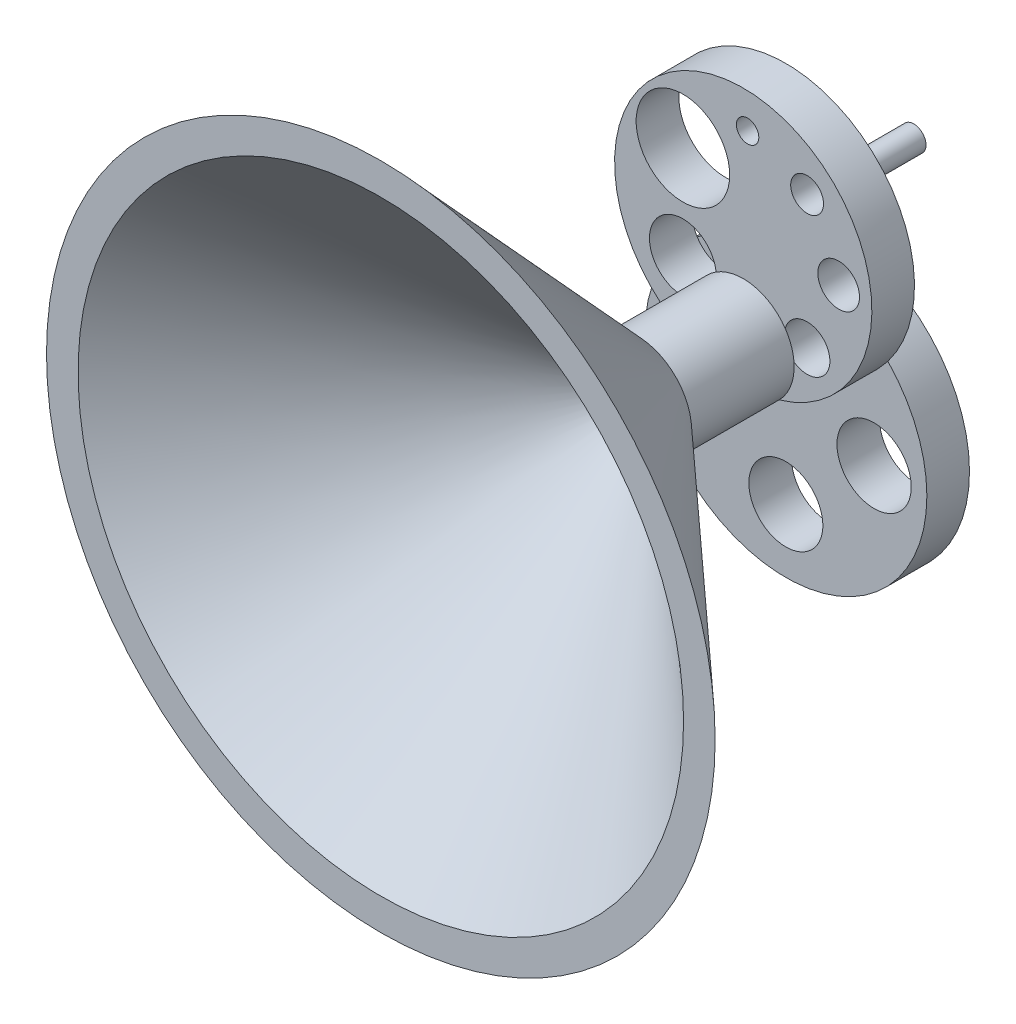
ISO-10303-21;
HEADER;
FILE_DESCRIPTION(('STEP AP214'),'2;1');
FILE_NAME('part.step','',(''),(''),'','','');
FILE_SCHEMA(('AUTOMOTIVE_DESIGN { 1 0 10303 214 1 1 1 1 }'));
ENDSEC;
DATA;
#1=APPLICATION_CONTEXT('core data for automotive mechanical design processes');
#2=APPLICATION_PROTOCOL_DEFINITION('international standard','automotive_design',2000,#1);
#3=PRODUCT_CONTEXT('',#1,'mechanical');
#4=PRODUCT('Part','Part','',(#3));
#5=PRODUCT_RELATED_PRODUCT_CATEGORY('part','',(#4));
#6=PRODUCT_DEFINITION_FORMATION('','',#4);
#7=PRODUCT_DEFINITION_CONTEXT('part definition',#1,'design');
#8=PRODUCT_DEFINITION('design','',#6,#7);
#9=PRODUCT_DEFINITION_SHAPE('','',#8);
#10=(LENGTH_UNIT() NAMED_UNIT(*) SI_UNIT(.MILLI.,.METRE.));
#11=(NAMED_UNIT(*) PLANE_ANGLE_UNIT() SI_UNIT($,.RADIAN.));
#12=(NAMED_UNIT(*) SI_UNIT($,.STERADIAN.) SOLID_ANGLE_UNIT());
#13=UNCERTAINTY_MEASURE_WITH_UNIT(LENGTH_MEASURE(1.E-05),#10,'distance_accuracy_value','');
#14=(GEOMETRIC_REPRESENTATION_CONTEXT(3) GLOBAL_UNCERTAINTY_ASSIGNED_CONTEXT((#13)) GLOBAL_UNIT_ASSIGNED_CONTEXT((#10,
#11,#12)) REPRESENTATION_CONTEXT('',''));
#15=CARTESIAN_POINT('',(0.,0.,0.));
#16=DIRECTION('',(0.,0.,1.));
#17=DIRECTION('',(1.,0.,0.));
#18=AXIS2_PLACEMENT_3D('',#15,#16,#17);
#19=CARTESIAN_POINT('',(0.,0.,0.));
#20=DIRECTION('',(0.,0.,1.));
#21=DIRECTION('',(1.,0.,0.));
#22=AXIS2_PLACEMENT_3D('',#19,#20,#21);
#23=PLANE('',#22);
#24=CARTESIAN_POINT('',(0.,-40.9991247059426,0.));
#25=DIRECTION('',(0.,0.,1.));
#26=DIRECTION('',(1.,0.,0.));
#27=AXIS2_PLACEMENT_3D('',#24,#25,#26);
#28=CIRCLE('',#27,12.5359342490684);
#29=CARTESIAN_POINT('',(12.5359342490684,-40.9991247059426,0.));
#30=VERTEX_POINT('',#29);
#31=EDGE_CURVE('E201',#30,#30,#28,.T.);
#32=ORIENTED_EDGE('',*,*,#31,.T.);
#33=EDGE_LOOP('',(#32));
#34=FACE_BOUND('',#33,.T.);
#35=CARTESIAN_POINT('',(-28.2941248850961,-22.6344067342699,0.));
#36=DIRECTION('',(0.,0.,1.));
#37=DIRECTION('',(1.,0.,0.));
#38=AXIS2_PLACEMENT_3D('',#35,#36,#37);
#39=CIRCLE('',#38,15.6917448653745);
#40=CARTESIAN_POINT('',(-18.0456026648547,-34.5171105183935,0.));
#41=VERTEX_POINT('',#40);
#42=CARTESIAN_POINT('',(-13.268101982062,-27.1565182584921,0.));
#43=VERTEX_POINT('',#42);
#44=EDGE_CURVE('E105',#41,#43,#39,.T.);
#45=ORIENTED_EDGE('',*,*,#44,.T.);
#46=CARTESIAN_POINT('',(0.,-40.9991247059426,0.));
#47=DIRECTION('',(0.,0.,-1.));
#48=DIRECTION('',(-1.,0.,0.));
#49=AXIS2_PLACEMENT_3D('',#46,#47,#48);
#50=CIRCLE('',#49,19.1744695745514);
#51=EDGE_CURVE('E117',#43,#41,#50,.T.);
#52=ORIENTED_EDGE('',*,*,#51,.T.);
#53=EDGE_LOOP('',(#45,#52));
#54=FACE_BOUND('',#53,.T.);
#55=ADVANCED_FACE('F41',(#34,#54),#23,.F.);
#56=CARTESIAN_POINT('',(0.,0.,20.));
#57=DIRECTION('',(0.,0.,1.));
#58=DIRECTION('',(1.,0.,0.));
#59=AXIS2_PLACEMENT_3D('',#56,#57,#58);
#60=PLANE('',#59);
#61=CARTESIAN_POINT('',(0.,-40.9991247059426,20.));
#62=DIRECTION('',(0.,0.,1.));
#63=DIRECTION('',(1.,0.,0.));
#64=AXIS2_PLACEMENT_3D('',#61,#62,#63);
#65=CIRCLE('',#64,12.5359342490684);
#66=CARTESIAN_POINT('',(12.5359342490684,-40.9991247059426,20.));
#67=VERTEX_POINT('',#66);
#68=EDGE_CURVE('E206',#67,#67,#65,.T.);
#69=ORIENTED_EDGE('',*,*,#68,.F.);
#70=EDGE_LOOP('',(#69));
#71=FACE_BOUND('',#70,.T.);
#72=CARTESIAN_POINT('',(-28.2941248850961,-22.6344067342699,20.));
#73=DIRECTION('',(0.,0.,1.));
#74=DIRECTION('',(1.,0.,0.));
#75=AXIS2_PLACEMENT_3D('',#72,#73,#74);
#76=CIRCLE('',#75,15.6917448653745);
#77=CARTESIAN_POINT('',(-16.6565006443831,-33.1604011743205,20.));
#78=VERTEX_POINT('',#77);
#79=CARTESIAN_POINT('',(-13.9416404614238,-28.9776746450751,20.));
#80=VERTEX_POINT('',#79);
#81=EDGE_CURVE('E283',#78,#80,#76,.T.);
#82=ORIENTED_EDGE('',*,*,#81,.F.);
#83=CARTESIAN_POINT('',(0.,-40.9991247059426,20.));
#84=DIRECTION('',(0.,0.,1.));
#85=DIRECTION('',(1.,0.,0.));
#86=AXIS2_PLACEMENT_3D('',#83,#84,#85);
#87=CIRCLE('',#86,18.4088185476836);
#88=EDGE_CURVE('E179',#78,#80,#87,.T.);
#89=ORIENTED_EDGE('',*,*,#88,.T.);
#90=EDGE_LOOP('',(#82,#89));
#91=FACE_BOUND('',#90,.T.);
#92=ADVANCED_FACE('F313',(#71,#91),#60,.T.);
#93=CARTESIAN_POINT('',(0.,-40.9991247059426,20.));
#94=DIRECTION('',(0.,0.,1.));
#95=DIRECTION('',(1.,0.,0.));
#96=AXIS2_PLACEMENT_3D('',#93,#94,#95);
#97=CIRCLE('',#96,23.8971101512251);
#98=CARTESIAN_POINT('',(19.6886766130824,-27.4555695299466,20.));
#99=VERTEX_POINT('',#98);
#100=CARTESIAN_POINT('',(-12.7141401336919,-20.7649329938769,20.));
#101=VERTEX_POINT('',#100);
#102=EDGE_CURVE('E50',#99,#101,#97,.T.);
#103=ORIENTED_EDGE('',*,*,#102,.F.);
#104=CARTESIAN_POINT('',(29.9805296795721,-30.3169174646603,20.));
#105=DIRECTION('',(0.,0.,1.));
#106=DIRECTION('',(1.,0.,0.));
#107=AXIS2_PLACEMENT_3D('',#104,#105,#106);
#108=CIRCLE('',#107,10.6822072412823);
#109=CARTESIAN_POINT('',(23.8167896979102,-39.0414725240411,20.));
#110=VERTEX_POINT('',#109);
#111=EDGE_CURVE('E219',#110,#99,#108,.T.);
#112=ORIENTED_EDGE('',*,*,#111,.F.);
#113=CARTESIAN_POINT('',(16.8371835045279,-57.9573417470893,20.));
#114=VERTEX_POINT('',#113);
#115=EDGE_CURVE('E190',#114,#110,#97,.T.);
#116=ORIENTED_EDGE('',*,*,#115,.F.);
#117=CARTESIAN_POINT('',(0.,0.,20.));
#118=DIRECTION('',(0.,0.,1.));
#119=DIRECTION('',(1.,0.,0.));
#120=AXIS2_PLACEMENT_3D('',#117,#118,#119);
#121=CIRCLE('',#120,60.3534937742137);
#122=CARTESIAN_POINT('',(-16.8371835045279,-57.9573417470893,20.));
#123=VERTEX_POINT('',#122);
#124=EDGE_CURVE('E248',#114,#123,#121,.T.);
#125=ORIENTED_EDGE('',*,*,#124,.T.);
#126=CARTESIAN_POINT('',(-23.6577908287346,-37.6255795849121,20.));
#127=VERTEX_POINT('',#126);
#128=EDGE_CURVE('E304',#127,#123,#97,.T.);
#129=ORIENTED_EDGE('',*,*,#128,.F.);
#130=EDGE_CURVE('E198',#101,#127,#76,.T.);
#131=ORIENTED_EDGE('',*,*,#130,.F.);
#132=EDGE_LOOP('',(#103,#112,#116,#125,#129,#131));
#133=FACE_BOUND('',#132,.T.);
#134=CARTESIAN_POINT('',(29.9805296795721,32.0800599309491,20.));
#135=DIRECTION('',(0.,0.,1.));
#136=DIRECTION('',(1.,0.,0.));
#137=AXIS2_PLACEMENT_3D('',#134,#135,#136);
#138=CIRCLE('',#137,7.70988318312936);
#139=CARTESIAN_POINT('',(37.6904128627015,32.0800599309491,20.));
#140=VERTEX_POINT('',#139);
#141=EDGE_CURVE('E231',#140,#140,#138,.T.);
#142=ORIENTED_EDGE('',*,*,#141,.F.);
#143=EDGE_LOOP('',(#142));
#144=FACE_BOUND('',#143,.T.);
#145=CARTESIAN_POINT('',(2.06116141547058,43.8848934922806,20.));
#146=DIRECTION('',(0.,0.,1.));
#147=DIRECTION('',(1.,0.,0.));
#148=AXIS2_PLACEMENT_3D('',#145,#146,#147);
#149=CIRCLE('',#148,5.24993766888649);
#150=CARTESIAN_POINT('',(7.31109908435707,43.8848934922806,20.));
#151=VERTEX_POINT('',#150);
#152=EDGE_CURVE('E239',#151,#151,#149,.T.);
#153=ORIENTED_EDGE('',*,*,#152,.F.);
#154=EDGE_LOOP('',(#153));
#155=FACE_BOUND('',#154,.T.);
#156=CARTESIAN_POINT('',(44.7834162088608,2.66166518286901,20.));
#157=DIRECTION('',(0.,0.,1.));
#158=DIRECTION('',(1.,0.,0.));
#159=AXIS2_PLACEMENT_3D('',#156,#157,#158);
#160=CIRCLE('',#159,9.77604921471006);
#161=CARTESIAN_POINT('',(54.5594654235709,2.66166518286901,20.));
#162=VERTEX_POINT('',#161);
#163=EDGE_CURVE('E223',#162,#162,#160,.T.);
#164=ORIENTED_EDGE('',*,*,#163,.F.);
#165=EDGE_LOOP('',(#164));
#166=FACE_BOUND('',#165,.T.);
#167=CARTESIAN_POINT('',(-28.2941248850961,21.7742528535962,20.));
#168=DIRECTION('',(0.,0.,1.));
#169=DIRECTION('',(1.,0.,0.));
#170=AXIS2_PLACEMENT_3D('',#167,#168,#169);
#171=CIRCLE('',#170,21.9333787794753);
#172=CARTESIAN_POINT('',(-6.36074610562086,21.7742528535962,20.));
#173=VERTEX_POINT('',#172);
#174=EDGE_CURVE('E191',#173,#173,#171,.T.);
#175=ORIENTED_EDGE('',*,*,#174,.F.);
#176=EDGE_LOOP('',(#175));
#177=FACE_BOUND('',#176,.T.);
#178=ADVANCED_FACE('F296',(#133,#144,#155,#166,#177),#60,.T.);
#179=CARTESIAN_POINT('',(0.,-82.4003965494338,0.));
#180=DIRECTION('',(0.,0.,-1.));
#181=DIRECTION('',(-1.,0.,0.));
#182=AXIS2_PLACEMENT_3D('',#179,#180,#181);
#183=CIRCLE('',#182,66.1528889519646);
#184=CARTESIAN_POINT('',(-47.875876853545,-36.7483962406285,0.));
#185=VERTEX_POINT('',#184);
#186=CARTESIAN_POINT('',(-41.5948348342577,-30.9603884642693,0.));
#187=VERTEX_POINT('',#186);
#188=EDGE_CURVE('E62',#185,#187,#183,.T.);
#189=ORIENTED_EDGE('',*,*,#188,.F.);
#190=CARTESIAN_POINT('',(0.,0.,0.));
#191=DIRECTION('',(0.,0.,1.));
#192=DIRECTION('',(1.,0.,0.));
#193=AXIS2_PLACEMENT_3D('',#190,#191,#192);
#194=CIRCLE('',#193,60.3534937742137);
#195=CARTESIAN_POINT('',(47.875876853545,-36.7483962406285,0.));
#196=VERTEX_POINT('',#195);
#197=EDGE_CURVE('E57',#196,#185,#194,.T.);
#198=ORIENTED_EDGE('',*,*,#197,.F.);
#199=CARTESIAN_POINT('',(40.6622982607996,-30.2201108388252,0.));
#200=VERTEX_POINT('',#199);
#201=EDGE_CURVE('E265',#200,#196,#183,.T.);
#202=ORIENTED_EDGE('',*,*,#201,.F.);
#203=CARTESIAN_POINT('',(29.9805296795721,-30.3169174646603,0.));
#204=DIRECTION('',(0.,0.,1.));
#205=DIRECTION('',(1.,0.,0.));
#206=AXIS2_PLACEMENT_3D('',#203,#204,#205);
#207=CIRCLE('',#206,10.6822072412823);
#208=CARTESIAN_POINT('',(24.6994107731454,-21.0314807683122,0.));
#209=VERTEX_POINT('',#208);
#210=EDGE_CURVE('E210',#200,#209,#207,.T.);
#211=ORIENTED_EDGE('',*,*,#210,.T.);
#212=CARTESIAN_POINT('',(-13.4238564515817,-17.6238205774183,0.));
#213=VERTEX_POINT('',#212);
#214=EDGE_CURVE('E270',#213,#209,#183,.T.);
#215=ORIENTED_EDGE('',*,*,#214,.F.);
#216=EDGE_CURVE('E131',#213,#187,#39,.T.);
#217=ORIENTED_EDGE('',*,*,#216,.T.);
#218=EDGE_LOOP('',(#189,#198,#202,#211,#215,#217));
#219=FACE_BOUND('',#218,.T.);
#220=CARTESIAN_POINT('',(0.,0.,0.));
#221=DIRECTION('',(0.,0.,1.));
#222=DIRECTION('',(1.,0.,0.));
#223=AXIS2_PLACEMENT_3D('',#220,#221,#222);
#224=CIRCLE('',#223,5.75824726428608);
#225=CARTESIAN_POINT('',(5.75824726428608,0.,0.));
#226=VERTEX_POINT('',#225);
#227=EDGE_CURVE('E12',#226,#226,#224,.F.);
#228=ORIENTED_EDGE('',*,*,#227,.F.);
#229=EDGE_LOOP('',(#228));
#230=FACE_BOUND('',#229,.T.);
#231=CARTESIAN_POINT('',(2.06116141547058,43.8848934922806,0.));
#232=DIRECTION('',(0.,0.,1.));
#233=DIRECTION('',(1.,0.,0.));
#234=AXIS2_PLACEMENT_3D('',#231,#232,#233);
#235=CIRCLE('',#234,5.24993766888649);
#236=CARTESIAN_POINT('',(7.31109908435707,43.8848934922806,0.));
#237=VERTEX_POINT('',#236);
#238=EDGE_CURVE('E235',#237,#237,#235,.T.);
#239=ORIENTED_EDGE('',*,*,#238,.T.);
#240=EDGE_LOOP('',(#239));
#241=FACE_BOUND('',#240,.T.);
#242=CARTESIAN_POINT('',(29.9805296795721,32.0800599309491,0.));
#243=DIRECTION('',(0.,0.,1.));
#244=DIRECTION('',(1.,0.,0.));
#245=AXIS2_PLACEMENT_3D('',#242,#243,#244);
#246=CIRCLE('',#245,7.70988318312936);
#247=CARTESIAN_POINT('',(37.6904128627015,32.0800599309491,0.));
#248=VERTEX_POINT('',#247);
#249=EDGE_CURVE('E227',#248,#248,#246,.T.);
#250=ORIENTED_EDGE('',*,*,#249,.T.);
#251=EDGE_LOOP('',(#250));
#252=FACE_BOUND('',#251,.T.);
#253=CARTESIAN_POINT('',(44.7834162088608,2.66166518286901,0.));
#254=DIRECTION('',(0.,0.,1.));
#255=DIRECTION('',(1.,0.,0.));
#256=AXIS2_PLACEMENT_3D('',#253,#254,#255);
#257=CIRCLE('',#256,9.77604921471006);
#258=CARTESIAN_POINT('',(54.5594654235709,2.66166518286901,0.));
#259=VERTEX_POINT('',#258);
#260=EDGE_CURVE('E218',#259,#259,#257,.T.);
#261=ORIENTED_EDGE('',*,*,#260,.T.);
#262=EDGE_LOOP('',(#261));
#263=FACE_BOUND('',#262,.T.);
#264=CARTESIAN_POINT('',(-28.2941248850961,21.7742528535962,0.));
#265=DIRECTION('',(0.,0.,1.));
#266=DIRECTION('',(1.,0.,0.));
#267=AXIS2_PLACEMENT_3D('',#264,#265,#266);
#268=CIRCLE('',#267,21.9333787794753);
#269=CARTESIAN_POINT('',(-6.36074610562086,21.7742528535962,0.));
#270=VERTEX_POINT('',#269);
#271=EDGE_CURVE('E184',#270,#270,#268,.T.);
#272=ORIENTED_EDGE('',*,*,#271,.T.);
#273=EDGE_LOOP('',(#272));
#274=FACE_BOUND('',#273,.T.);
#275=ADVANCED_FACE('F337',(#219,#230,#241,#252,#263,#274),#23,.F.);
#276=CARTESIAN_POINT('',(0.,0.,20.));
#277=DIRECTION('',(0.,0.,-1.));
#278=DIRECTION('',(-1.,0.,0.));
#279=AXIS2_PLACEMENT_3D('',#276,#277,#278);
#280=CYLINDRICAL_SURFACE('',#279,60.3534937742137);
#281=EDGE_CURVE('E246',#123,#114,#121,.T.);
#282=ORIENTED_EDGE('',*,*,#281,.F.);
#283=ORIENTED_EDGE('',*,*,#124,.F.);
#284=EDGE_LOOP('',(#282,#283));
#285=FACE_BOUND('',#284,.T.);
#286=EDGE_CURVE('E249',#185,#196,#194,.T.);
#287=ORIENTED_EDGE('',*,*,#286,.T.);
#288=ORIENTED_EDGE('',*,*,#197,.T.);
#289=EDGE_LOOP('',(#287,#288));
#290=FACE_BOUND('',#289,.T.);
#291=ADVANCED_FACE('F43',(#285,#290),#280,.T.);
#292=CARTESIAN_POINT('',(2.06116141547058,43.8848934922806,20.));
#293=DIRECTION('',(0.,0.,-1.));
#294=DIRECTION('',(-1.,0.,0.));
#295=AXIS2_PLACEMENT_3D('',#292,#293,#294);
#296=CYLINDRICAL_SURFACE('',#295,5.24993766888649);
#297=ORIENTED_EDGE('',*,*,#152,.T.);
#298=EDGE_LOOP('',(#297));
#299=FACE_BOUND('',#298,.T.);
#300=ORIENTED_EDGE('',*,*,#238,.F.);
#301=EDGE_LOOP('',(#300));
#302=FACE_BOUND('',#301,.T.);
#303=ADVANCED_FACE('F348',(#299,#302),#296,.F.);
#304=CARTESIAN_POINT('',(29.9805296795721,32.0800599309491,20.));
#305=DIRECTION('',(0.,0.,-1.));
#306=DIRECTION('',(-1.,0.,0.));
#307=AXIS2_PLACEMENT_3D('',#304,#305,#306);
#308=CYLINDRICAL_SURFACE('',#307,7.70988318312936);
#309=ORIENTED_EDGE('',*,*,#141,.T.);
#310=EDGE_LOOP('',(#309));
#311=FACE_BOUND('',#310,.T.);
#312=ORIENTED_EDGE('',*,*,#249,.F.);
#313=EDGE_LOOP('',(#312));
#314=FACE_BOUND('',#313,.T.);
#315=ADVANCED_FACE('F377',(#311,#314),#308,.F.);
#316=CARTESIAN_POINT('',(44.7834162088608,2.66166518286901,20.));
#317=DIRECTION('',(0.,0.,-1.));
#318=DIRECTION('',(-1.,0.,0.));
#319=AXIS2_PLACEMENT_3D('',#316,#317,#318);
#320=CYLINDRICAL_SURFACE('',#319,9.77604921471006);
#321=ORIENTED_EDGE('',*,*,#163,.T.);
#322=EDGE_LOOP('',(#321));
#323=FACE_BOUND('',#322,.T.);
#324=ORIENTED_EDGE('',*,*,#260,.F.);
#325=EDGE_LOOP('',(#324));
#326=FACE_BOUND('',#325,.T.);
#327=ADVANCED_FACE('F374',(#323,#326),#320,.F.);
#328=CARTESIAN_POINT('',(29.9805296795721,-30.3169174646603,20.));
#329=DIRECTION('',(0.,0.,-1.));
#330=DIRECTION('',(-1.,0.,0.));
#331=AXIS2_PLACEMENT_3D('',#328,#329,#330);
#332=CYLINDRICAL_SURFACE('',#331,10.6822072412823);
#333=EDGE_CURVE('E214',#99,#110,#108,.T.);
#334=ORIENTED_EDGE('',*,*,#333,.T.);
#335=ORIENTED_EDGE('',*,*,#111,.T.);
#336=EDGE_LOOP('',(#334,#335));
#337=FACE_BOUND('',#336,.T.);
#338=ORIENTED_EDGE('',*,*,#210,.F.);
#339=CARTESIAN_POINT('',(29.9805296795721,-30.3169174646603,0.));
#340=DIRECTION('',(0.,0.,-1.));
#341=DIRECTION('',(-1.,0.,0.));
#342=AXIS2_PLACEMENT_3D('',#339,#340,#341);
#343=CIRCLE('',#342,10.6822072412823);
#344=EDGE_CURVE('E145',#200,#209,#343,.T.);
#345=ORIENTED_EDGE('',*,*,#344,.T.);
#346=EDGE_LOOP('',(#338,#345));
#347=FACE_BOUND('',#346,.T.);
#348=ADVANCED_FACE('F291',(#337,#347),#332,.F.);
#349=CARTESIAN_POINT('',(0.,-40.9991247059426,20.));
#350=DIRECTION('',(0.,0.,-1.));
#351=DIRECTION('',(-1.,0.,0.));
#352=AXIS2_PLACEMENT_3D('',#349,#350,#351);
#353=CYLINDRICAL_SURFACE('',#352,12.5359342490684);
#354=ORIENTED_EDGE('',*,*,#68,.T.);
#355=EDGE_LOOP('',(#354));
#356=FACE_BOUND('',#355,.T.);
#357=ORIENTED_EDGE('',*,*,#31,.F.);
#358=EDGE_LOOP('',(#357));
#359=FACE_BOUND('',#358,.T.);
#360=ADVANCED_FACE('F366',(#356,#359),#353,.F.);
#361=CARTESIAN_POINT('',(-28.2941248850961,-22.6344067342699,20.));
#362=DIRECTION('',(0.,0.,-1.));
#363=DIRECTION('',(-1.,0.,0.));
#364=AXIS2_PLACEMENT_3D('',#361,#362,#363);
#365=CYLINDRICAL_SURFACE('',#364,15.6917448653745);
#366=ORIENTED_EDGE('',*,*,#130,.T.);
#367=EDGE_CURVE('E202',#127,#78,#76,.T.);
#368=ORIENTED_EDGE('',*,*,#367,.T.);
#369=ORIENTED_EDGE('',*,*,#81,.T.);
#370=EDGE_CURVE('E203',#80,#101,#76,.T.);
#371=ORIENTED_EDGE('',*,*,#370,.T.);
#372=EDGE_LOOP('',(#366,#368,#369,#371));
#373=FACE_BOUND('',#372,.T.);
#374=ORIENTED_EDGE('',*,*,#216,.F.);
#375=EDGE_CURVE('E112',#43,#213,#39,.T.);
#376=ORIENTED_EDGE('',*,*,#375,.F.);
#377=ORIENTED_EDGE('',*,*,#44,.F.);
#378=EDGE_CURVE('E110',#187,#41,#39,.T.);
#379=ORIENTED_EDGE('',*,*,#378,.F.);
#380=EDGE_LOOP('',(#374,#376,#377,#379));
#381=FACE_BOUND('',#380,.T.);
#382=ADVANCED_FACE('F108',(#373,#381),#365,.F.);
#383=CARTESIAN_POINT('',(-28.2941248850961,21.7742528535962,20.));
#384=DIRECTION('',(0.,0.,-1.));
#385=DIRECTION('',(-1.,0.,0.));
#386=AXIS2_PLACEMENT_3D('',#383,#384,#385);
#387=CYLINDRICAL_SURFACE('',#386,21.9333787794753);
#388=ORIENTED_EDGE('',*,*,#174,.T.);
#389=EDGE_LOOP('',(#388));
#390=FACE_BOUND('',#389,.T.);
#391=ORIENTED_EDGE('',*,*,#271,.F.);
#392=EDGE_LOOP('',(#391));
#393=FACE_BOUND('',#392,.T.);
#394=ADVANCED_FACE('F332',(#390,#393),#387,.F.);
#395=CARTESIAN_POINT('',(0.,-40.9991247059426,20.));
#396=DIRECTION('',(0.,0.,1.));
#397=DIRECTION('',(1.,0.,0.));
#398=AXIS2_PLACEMENT_3D('',#395,#396,#397);
#399=PLANE('',#398);
#400=ORIENTED_EDGE('',*,*,#367,.F.);
#401=EDGE_CURVE('E189',#101,#127,#97,.T.);
#402=ORIENTED_EDGE('',*,*,#401,.F.);
#403=ORIENTED_EDGE('',*,*,#370,.F.);
#404=EDGE_CURVE('E174',#80,#78,#87,.T.);
#405=ORIENTED_EDGE('',*,*,#404,.T.);
#406=EDGE_LOOP('',(#400,#402,#403,#405));
#407=FACE_BOUND('',#406,.T.);
#408=ADVANCED_FACE('F318',(#407),#399,.F.);
#409=EDGE_CURVE('E178',#123,#114,#97,.T.);
#410=ORIENTED_EDGE('',*,*,#409,.F.);
#411=ORIENTED_EDGE('',*,*,#281,.T.);
#412=EDGE_LOOP('',(#410,#411));
#413=FACE_BOUND('',#412,.T.);
#414=ADVANCED_FACE('F323',(#413),#399,.F.);
#415=ORIENTED_EDGE('',*,*,#333,.F.);
#416=EDGE_CURVE('E185',#110,#99,#97,.T.);
#417=ORIENTED_EDGE('',*,*,#416,.F.);
#418=EDGE_LOOP('',(#415,#417));
#419=FACE_BOUND('',#418,.T.);
#420=ADVANCED_FACE('F325',(#419),#399,.F.);
#421=CARTESIAN_POINT('',(0.,-40.9991247059426,70.));
#422=DIRECTION('',(0.,0.,-1.));
#423=DIRECTION('',(-1.,0.,0.));
#424=AXIS2_PLACEMENT_3D('',#421,#422,#423);
#425=CYLINDRICAL_SURFACE('',#424,23.8971101512251);
#426=CARTESIAN_POINT('',(0.,-40.9991247059426,70.));
#427=DIRECTION('',(0.,0.,1.));
#428=DIRECTION('',(1.,0.,0.));
#429=AXIS2_PLACEMENT_3D('',#426,#427,#428);
#430=CIRCLE('',#429,23.8971101512251);
#431=CARTESIAN_POINT('',(23.8971101512251,-40.9991247059426,70.));
#432=VERTEX_POINT('',#431);
#433=EDGE_CURVE('E180',#432,#432,#430,.T.);
#434=ORIENTED_EDGE('',*,*,#433,.F.);
#435=EDGE_LOOP('',(#434));
#436=FACE_BOUND('',#435,.T.);
#437=ORIENTED_EDGE('',*,*,#416,.T.);
#438=ORIENTED_EDGE('',*,*,#102,.T.);
#439=ORIENTED_EDGE('',*,*,#401,.T.);
#440=ORIENTED_EDGE('',*,*,#128,.T.);
#441=ORIENTED_EDGE('',*,*,#409,.T.);
#442=ORIENTED_EDGE('',*,*,#115,.T.);
#443=EDGE_LOOP('',(#437,#438,#439,#440,#441,#442));
#444=FACE_BOUND('',#443,.T.);
#445=ADVANCED_FACE('F319',(#436,#444),#425,.T.);
#446=CARTESIAN_POINT('',(0.,-40.9991247059426,70.));
#447=DIRECTION('',(0.,0.,-1.));
#448=DIRECTION('',(-1.,0.,0.));
#449=AXIS2_PLACEMENT_3D('',#446,#447,#448);
#450=CYLINDRICAL_SURFACE('',#449,18.4088185476836);
#451=CARTESIAN_POINT('',(0.,-40.9991247059426,70.));
#452=DIRECTION('',(0.,0.,1.));
#453=DIRECTION('',(1.,0.,0.));
#454=AXIS2_PLACEMENT_3D('',#451,#452,#453);
#455=CIRCLE('',#454,18.4088185476836);
#456=CARTESIAN_POINT('',(18.4088185476836,-40.9991247059426,70.));
#457=VERTEX_POINT('',#456);
#458=EDGE_CURVE('E170',#457,#457,#455,.T.);
#459=ORIENTED_EDGE('',*,*,#458,.T.);
#460=EDGE_LOOP('',(#459));
#461=FACE_BOUND('',#460,.T.);
#462=ORIENTED_EDGE('',*,*,#404,.F.);
#463=ORIENTED_EDGE('',*,*,#88,.F.);
#464=EDGE_LOOP('',(#462,#463));
#465=FACE_BOUND('',#464,.T.);
#466=ADVANCED_FACE('F550',(#461,#465),#450,.F.);
#467=CARTESIAN_POINT('',(0.,-40.9991247059426,70.));
#468=DIRECTION('',(0.,0.,1.));
#469=DIRECTION('',(1.,0.,0.));
#470=AXIS2_PLACEMENT_3D('',#467,#468,#469);
#471=PLANE('',#470);
#472=CARTESIAN_POINT('',(0.,-40.9991247059426,70.));
#473=DIRECTION('',(0.,0.,1.));
#474=DIRECTION('',(1.,0.,0.));
#475=AXIS2_PLACEMENT_3D('',#472,#473,#474);
#476=CIRCLE('',#475,11.0058348254533);
#477=CARTESIAN_POINT('',(11.0058348254533,-40.9991247059426,70.));
#478=VERTEX_POINT('',#477);
#479=EDGE_CURVE('E158',#478,#478,#476,.T.);
#480=ORIENTED_EDGE('',*,*,#479,.T.);
#481=EDGE_LOOP('',(#480));
#482=FACE_BOUND('',#481,.T.);
#483=ORIENTED_EDGE('',*,*,#458,.F.);
#484=EDGE_LOOP('',(#483));
#485=FACE_BOUND('',#484,.T.);
#486=ADVANCED_FACE('F543',(#482,#485),#471,.F.);
#487=CARTESIAN_POINT('',(0.,-40.9991247059426,190.));
#488=DIRECTION('',(0.,0.,-1.));
#489=DIRECTION('',(-1.,0.,0.));
#490=AXIS2_PLACEMENT_3D('',#487,#488,#489);
#491=PLANE('',#490);
#492=CARTESIAN_POINT('',(0.,-40.9991247059426,190.));
#493=DIRECTION('',(0.,0.,-1.));
#494=DIRECTION('',(-1.,0.,0.));
#495=AXIS2_PLACEMENT_3D('',#492,#493,#494);
#496=CIRCLE('',#495,156.835467167389);
#497=CARTESIAN_POINT('',(156.835467167389,-40.9991247059426,190.));
#498=VERTEX_POINT('',#497);
#499=EDGE_CURVE('E162',#498,#498,#496,.T.);
#500=ORIENTED_EDGE('',*,*,#499,.F.);
#501=EDGE_LOOP('',(#500));
#502=FACE_BOUND('',#501,.T.);
#503=CARTESIAN_POINT('',(0.,-40.9991247059426,190.));
#504=DIRECTION('',(0.,0.,-1.));
#505=DIRECTION('',(-1.,0.,0.));
#506=AXIS2_PLACEMENT_3D('',#503,#504,#505);
#507=CIRCLE('',#506,142.029499722929);
#508=CARTESIAN_POINT('',(142.029499722929,-40.9991247059426,190.));
#509=VERTEX_POINT('',#508);
#510=EDGE_CURVE('E154',#509,#509,#507,.T.);
#511=ORIENTED_EDGE('',*,*,#510,.T.);
#512=EDGE_LOOP('',(#511));
#513=FACE_BOUND('',#512,.T.);
#514=ADVANCED_FACE('F539',(#502,#513),#491,.F.);
#515=ORIENTED_EDGE('',*,*,#433,.T.);
#516=EDGE_LOOP('',(#515));
#517=FACE_BOUND('',#516,.T.);
#518=CARTESIAN_POINT('',(0.,-40.9991247059426,70.));
#519=DIRECTION('',(0.,0.,1.));
#520=DIRECTION('',(1.,0.,0.));
#521=AXIS2_PLACEMENT_3D('',#518,#519,#520);
#522=CIRCLE('',#521,25.811802269914);
#523=CARTESIAN_POINT('',(25.8118022699139,-40.9991247059426,70.));
#524=VERTEX_POINT('',#523);
#525=EDGE_CURVE('E166',#524,#524,#522,.T.);
#526=ORIENTED_EDGE('',*,*,#525,.F.);
#527=EDGE_LOOP('',(#526));
#528=FACE_BOUND('',#527,.T.);
#529=ADVANCED_FACE('F542',(#517,#528),#471,.F.);
#530=CARTESIAN_POINT('',(0.,-40.9991247059426,66.3127574127075));
#531=DIRECTION('',(0.,0.,1.));
#532=DIRECTION('',(1.,0.,0.));
#533=AXIS2_PLACEMENT_3D('',#530,#531,#532);
#534=CONICAL_SURFACE('',#533,21.785835293638,0.829284809151568);
#535=CARTESIAN_POINT('',(156.835467167389,-40.9991247059426,190.));
#536=CARTESIAN_POINT('',(155.470637324707,-40.9991247059426,188.75));
#537=CARTESIAN_POINT('',(154.105807482025,-40.9991247059426,187.5));
#538=CARTESIAN_POINT('',(151.376147796661,-40.9991247059426,185.));
#539=CARTESIAN_POINT('',(150.011317953979,-40.9991247059426,183.75));
#540=CARTESIAN_POINT('',(147.281658268615,-40.9991247059426,181.25));
#541=CARTESIAN_POINT('',(145.916828425933,-40.9991247059426,180.));
#542=CARTESIAN_POINT('',(143.187168740569,-40.9991247059426,177.5));
#543=CARTESIAN_POINT('',(141.822338897887,-40.9991247059426,176.25));
#544=CARTESIAN_POINT('',(139.092679212523,-40.9991247059426,173.75));
#545=CARTESIAN_POINT('',(137.727849369841,-40.9991247059426,172.5));
#546=CARTESIAN_POINT('',(134.998189684477,-40.9991247059426,170.));
#547=CARTESIAN_POINT('',(133.633359841795,-40.9991247059426,168.75));
#548=CARTESIAN_POINT('',(130.903700156431,-40.9991247059426,166.25));
#549=CARTESIAN_POINT('',(129.538870313749,-40.9991247059426,165.));
#550=CARTESIAN_POINT('',(126.809210628384,-40.9991247059426,162.5));
#551=CARTESIAN_POINT('',(125.444380785702,-40.9991247059426,161.25));
#552=CARTESIAN_POINT('',(122.714721100338,-40.9991247059426,158.75));
#553=CARTESIAN_POINT('',(121.349891257656,-40.9991247059426,157.5));
#554=CARTESIAN_POINT('',(118.620231572292,-40.9991247059426,155.));
#555=CARTESIAN_POINT('',(117.25540172961,-40.9991247059426,153.75));
#556=CARTESIAN_POINT('',(114.525742044246,-40.9991247059426,151.25));
#557=CARTESIAN_POINT('',(113.160912201564,-40.9991247059426,150.));
#558=CARTESIAN_POINT('',(110.4312525162,-40.9991247059426,147.5));
#559=CARTESIAN_POINT('',(109.066422673518,-40.9991247059426,146.25));
#560=CARTESIAN_POINT('',(106.336762988154,-40.9991247059426,143.75));
#561=CARTESIAN_POINT('',(104.971933145472,-40.9991247059426,142.5));
#562=CARTESIAN_POINT('',(102.242273460108,-40.9991247059426,140.));
#563=CARTESIAN_POINT('',(100.877443617426,-40.9991247059426,138.75));
#564=CARTESIAN_POINT('',(98.1477839320618,-40.9991247059426,136.25));
#565=CARTESIAN_POINT('',(96.7829540893797,-40.9991247059426,135.));
#566=CARTESIAN_POINT('',(94.0532944040157,-40.9991247059426,132.5));
#567=CARTESIAN_POINT('',(92.6884645613336,-40.9991247059426,131.25));
#568=CARTESIAN_POINT('',(89.9588048759695,-40.9991247059426,128.75));
#569=CARTESIAN_POINT('',(88.5939750332875,-40.9991247059426,127.5));
#570=CARTESIAN_POINT('',(85.8643153479234,-40.9991247059426,125.));
#571=CARTESIAN_POINT('',(84.4994855052414,-40.9991247059426,123.75));
#572=CARTESIAN_POINT('',(81.7698258198773,-40.9991247059426,121.25));
#573=CARTESIAN_POINT('',(80.4049959771953,-40.9991247059426,120.));
#574=CARTESIAN_POINT('',(77.6753362918313,-40.9991247059426,117.5));
#575=CARTESIAN_POINT('',(76.3105064491492,-40.9991247059426,116.25));
#576=CARTESIAN_POINT('',(73.5808467637851,-40.9991247059426,113.75));
#577=CARTESIAN_POINT('',(72.2160169211031,-40.9991247059426,112.5));
#578=CARTESIAN_POINT('',(69.486357235739,-40.9991247059426,110.));
#579=CARTESIAN_POINT('',(68.121527393057,-40.9991247059426,108.75));
#580=CARTESIAN_POINT('',(65.3918677076929,-40.9991247059426,106.25));
#581=CARTESIAN_POINT('',(64.0270378650109,-40.9991247059426,105.));
#582=CARTESIAN_POINT('',(61.2973781796468,-40.9991247059426,102.5));
#583=CARTESIAN_POINT('',(59.9325483369648,-40.9991247059426,101.25));
#584=CARTESIAN_POINT('',(57.2028886516007,-40.9991247059426,98.75));
#585=CARTESIAN_POINT('',(55.8380588089187,-40.9991247059426,97.5));
#586=CARTESIAN_POINT('',(53.1083991235546,-40.9991247059426,95.));
#587=CARTESIAN_POINT('',(51.7435692808726,-40.9991247059426,93.75));
#588=CARTESIAN_POINT('',(49.0139095955085,-40.9991247059426,91.25));
#589=CARTESIAN_POINT('',(47.6490797528265,-40.9991247059426,90.));
#590=CARTESIAN_POINT('',(44.9194200674624,-40.9991247059426,87.5));
#591=CARTESIAN_POINT('',(43.5545902247804,-40.9991247059426,86.25));
#592=CARTESIAN_POINT('',(40.8249305394163,-40.9991247059426,83.75));
#593=CARTESIAN_POINT('',(39.4601006967343,-40.9991247059426,82.5));
#594=CARTESIAN_POINT('',(36.7304410113702,-40.9991247059426,80.));
#595=CARTESIAN_POINT('',(35.3656111686882,-40.9991247059426,78.75));
#596=CARTESIAN_POINT('',(32.6359514833241,-40.9991247059426,76.25));
#597=CARTESIAN_POINT('',(31.2711216406421,-40.9991247059426,75.));
#598=CARTESIAN_POINT('',(28.541461955278,-40.9991247059426,72.5));
#599=CARTESIAN_POINT('',(27.176632112596,-40.9991247059426,71.25));
#600=CARTESIAN_POINT('',(25.811802269914,-40.9991247059426,70.));
#601=B_SPLINE_CURVE_WITH_KNOTS('',3,(#535,#536,#537,#538,#539,#540,#541,#542,#543,#544,#545,
#546,#547,#548,#549,#550,#551,#552,#553,#554,#555,#556,#557,#558,#559,#560,#561,#562,#563,#564,
#565,#566,#567,#568,#569,#570,#571,#572,#573,#574,#575,#576,#577,#578,#579,#580,#581,#582,#583,
#584,#585,#586,#587,#588,#589,#590,#591,#592,#593,#594,#595,#596,#597,#598,#599,#600),
.UNSPECIFIED.,.F.,.F.,(4,2,2,2,2,2,2,2,2,2,2,2,2,2,2,2,2,2,2,2,2,2,2,2,2,2,2,2,2,2,2,2,4),(0.,
5.55223779167275,11.1044755833455,16.6567133750183,22.208951166691,27.7611889583638,
33.3134267500366,38.8656645417093,44.4179023333821,49.9701401250548,55.5223779167276,
61.0746157084004,66.6268535000731,72.1790912917459,77.7313290834186,83.2835668750914,
88.8358046667641,94.3880424584369,99.9402802501097,105.492518041782,111.044755833455,
116.596993625128,122.149231416801,127.701469208473,133.253707000146,138.805944791819,
144.358182583492,149.910420375165,155.462658166837,161.01489595851,166.567133750183,
172.119371541856,177.671609333528),.UNSPECIFIED.);
#602=EDGE_CURVE('BSEAM537',#498,#524,#601,.T.);
#603=ORIENTED_EDGE('',*,*,#499,.T.);
#604=ORIENTED_EDGE('',*,*,#525,.T.);
#605=ORIENTED_EDGE('',*,*,#602,.T.);
#606=ORIENTED_EDGE('',*,*,#602,.F.);
#607=EDGE_LOOP('',(#603,#605,#604,#606));
#608=FACE_BOUND('',#607,.T.);
#609=ADVANCED_FACE('F537',(#608),#534,.T.);
#610=CARTESIAN_POINT('',(0.,-40.9991247059426,73.6872425872925));
#611=DIRECTION('',(0.,0.,1.));
#612=DIRECTION('',(1.,0.,0.));
#613=AXIS2_PLACEMENT_3D('',#610,#611,#612);
#614=CONICAL_SURFACE('',#613,15.0318018017292,0.829284809151568);
#615=CARTESIAN_POINT('',(142.029499722929,-40.9991247059426,190.));
#616=CARTESIAN_POINT('',(140.664669880246,-40.9991247059426,188.75));
#617=CARTESIAN_POINT('',(139.299840037564,-40.9991247059426,187.5));
#618=CARTESIAN_POINT('',(136.5701803522,-40.9991247059426,185.));
#619=CARTESIAN_POINT('',(135.205350509518,-40.9991247059426,183.75));
#620=CARTESIAN_POINT('',(132.475690824154,-40.9991247059426,181.25));
#621=CARTESIAN_POINT('',(131.110860981472,-40.9991247059426,180.));
#622=CARTESIAN_POINT('',(128.381201296108,-40.9991247059426,177.5));
#623=CARTESIAN_POINT('',(127.016371453426,-40.9991247059426,176.25));
#624=CARTESIAN_POINT('',(124.286711768062,-40.9991247059426,173.75));
#625=CARTESIAN_POINT('',(122.92188192538,-40.9991247059426,172.5));
#626=CARTESIAN_POINT('',(120.192222240016,-40.9991247059426,170.));
#627=CARTESIAN_POINT('',(118.827392397334,-40.9991247059426,168.75));
#628=CARTESIAN_POINT('',(116.09773271197,-40.9991247059426,166.25));
#629=CARTESIAN_POINT('',(114.732902869288,-40.9991247059426,165.));
#630=CARTESIAN_POINT('',(112.003243183924,-40.9991247059426,162.5));
#631=CARTESIAN_POINT('',(110.638413341242,-40.9991247059426,161.25));
#632=CARTESIAN_POINT('',(107.908753655878,-40.9991247059426,158.75));
#633=CARTESIAN_POINT('',(106.543923813196,-40.9991247059426,157.5));
#634=CARTESIAN_POINT('',(103.814264127832,-40.9991247059426,155.));
#635=CARTESIAN_POINT('',(102.44943428515,-40.9991247059426,153.75));
#636=CARTESIAN_POINT('',(99.7197745997855,-40.9991247059426,151.25));
#637=CARTESIAN_POINT('',(98.3549447571034,-40.9991247059426,150.));
#638=CARTESIAN_POINT('',(95.6252850717394,-40.9991247059426,147.5));
#639=CARTESIAN_POINT('',(94.2604552290573,-40.9991247059426,146.25));
#640=CARTESIAN_POINT('',(91.5307955436933,-40.9991247059426,143.75));
#641=CARTESIAN_POINT('',(90.1659657010112,-40.9991247059426,142.5));
#642=CARTESIAN_POINT('',(87.4363060156472,-40.9991247059426,140.));
#643=CARTESIAN_POINT('',(86.0714761729651,-40.9991247059426,138.75));
#644=CARTESIAN_POINT('',(83.3418164876011,-40.9991247059426,136.25));
#645=CARTESIAN_POINT('',(81.976986644919,-40.9991247059426,135.));
#646=CARTESIAN_POINT('',(79.247326959555,-40.9991247059426,132.5));
#647=CARTESIAN_POINT('',(77.8824971168729,-40.9991247059426,131.25));
#648=CARTESIAN_POINT('',(75.1528374315089,-40.9991247059426,128.75));
#649=CARTESIAN_POINT('',(73.7880075888268,-40.9991247059426,127.5));
#650=CARTESIAN_POINT('',(71.0583479034628,-40.9991247059426,125.));
#651=CARTESIAN_POINT('',(69.6935180607807,-40.9991247059426,123.75));
#652=CARTESIAN_POINT('',(66.9638583754167,-40.9991247059426,121.25));
#653=CARTESIAN_POINT('',(65.5990285327346,-40.9991247059426,120.));
#654=CARTESIAN_POINT('',(62.8693688473706,-40.9991247059426,117.5));
#655=CARTESIAN_POINT('',(61.5045390046885,-40.9991247059426,116.25));
#656=CARTESIAN_POINT('',(58.7748793193245,-40.9991247059426,113.75));
#657=CARTESIAN_POINT('',(57.4100494766424,-40.9991247059426,112.5));
#658=CARTESIAN_POINT('',(54.6803897912784,-40.9991247059426,110.));
#659=CARTESIAN_POINT('',(53.3155599485963,-40.9991247059426,108.75));
#660=CARTESIAN_POINT('',(50.5859002632323,-40.9991247059426,106.25));
#661=CARTESIAN_POINT('',(49.2210704205502,-40.9991247059426,105.));
#662=CARTESIAN_POINT('',(46.4914107351861,-40.9991247059426,102.5));
#663=CARTESIAN_POINT('',(45.1265808925041,-40.9991247059426,101.25));
#664=CARTESIAN_POINT('',(42.39692120714,-40.9991247059426,98.75));
#665=CARTESIAN_POINT('',(41.032091364458,-40.9991247059426,97.5));
#666=CARTESIAN_POINT('',(38.3024316790939,-40.9991247059426,95.));
#667=CARTESIAN_POINT('',(36.9376018364119,-40.9991247059426,93.75));
#668=CARTESIAN_POINT('',(34.2079421510478,-40.9991247059426,91.25));
#669=CARTESIAN_POINT('',(32.8431123083658,-40.9991247059426,90.));
#670=CARTESIAN_POINT('',(30.1134526230017,-40.9991247059426,87.5));
#671=CARTESIAN_POINT('',(28.7486227803197,-40.9991247059426,86.25));
#672=CARTESIAN_POINT('',(26.0189630949556,-40.9991247059426,83.75));
#673=CARTESIAN_POINT('',(24.6541332522736,-40.9991247059426,82.5));
#674=CARTESIAN_POINT('',(21.9244735669095,-40.9991247059426,80.));
#675=CARTESIAN_POINT('',(20.5596437242275,-40.9991247059426,78.75));
#676=CARTESIAN_POINT('',(17.8299840388634,-40.9991247059426,76.25));
#677=CARTESIAN_POINT('',(16.4651541961814,-40.9991247059426,75.));
#678=CARTESIAN_POINT('',(13.7354945108173,-40.9991247059426,72.5));
#679=CARTESIAN_POINT('',(12.3706646681353,-40.9991247059426,71.25));
#680=CARTESIAN_POINT('',(11.0058348254533,-40.9991247059426,70.));
#681=B_SPLINE_CURVE_WITH_KNOTS('',3,(#615,#616,#617,#618,#619,#620,#621,#622,#623,#624,#625,
#626,#627,#628,#629,#630,#631,#632,#633,#634,#635,#636,#637,#638,#639,#640,#641,#642,#643,#644,
#645,#646,#647,#648,#649,#650,#651,#652,#653,#654,#655,#656,#657,#658,#659,#660,#661,#662,#663,
#664,#665,#666,#667,#668,#669,#670,#671,#672,#673,#674,#675,#676,#677,#678,#679,#680),
.UNSPECIFIED.,.F.,.F.,(4,2,2,2,2,2,2,2,2,2,2,2,2,2,2,2,2,2,2,2,2,2,2,2,2,2,2,2,2,2,2,2,4),(0.,
5.55223779167277,11.1044755833455,16.6567133750183,22.208951166691,27.7611889583638,
33.3134267500365,38.8656645417093,44.4179023333821,49.9701401250548,55.5223779167276,
61.0746157084004,66.6268535000731,72.1790912917459,77.7313290834186,83.2835668750914,
88.8358046667641,94.3880424584369,99.9402802501097,105.492518041782,111.044755833455,
116.596993625128,122.149231416801,127.701469208473,133.253707000146,138.805944791819,
144.358182583492,149.910420375165,155.462658166837,161.01489595851,166.567133750183,
172.119371541856,177.671609333528),.UNSPECIFIED.);
#682=EDGE_CURVE('BSEAM533',#509,#478,#681,.T.);
#683=ORIENTED_EDGE('',*,*,#510,.F.);
#684=ORIENTED_EDGE('',*,*,#479,.F.);
#685=ORIENTED_EDGE('',*,*,#682,.T.);
#686=ORIENTED_EDGE('',*,*,#682,.F.);
#687=EDGE_LOOP('',(#683,#685,#684,#686));
#688=FACE_BOUND('',#687,.T.);
#689=ADVANCED_FACE('F533',(#688),#614,.F.);
#690=CARTESIAN_POINT('',(0.,0.,-60.));
#691=DIRECTION('',(0.,0.,1.));
#692=DIRECTION('',(1.,0.,0.));
#693=AXIS2_PLACEMENT_3D('',#690,#691,#692);
#694=CYLINDRICAL_SURFACE('',#693,5.75824726428608);
#695=CARTESIAN_POINT('',(0.,0.,-60.));
#696=DIRECTION('',(0.,0.,-1.));
#697=DIRECTION('',(-1.,0.,0.));
#698=AXIS2_PLACEMENT_3D('',#695,#696,#697);
#699=CIRCLE('',#698,5.75824726428608);
#700=CARTESIAN_POINT('',(5.75824726428608,0.,-60.));
#701=VERTEX_POINT('',#700);
#702=EDGE_CURVE('E150',#701,#701,#699,.T.);
#703=CARTESIAN_POINT('',(5.75824726428608,0.,-60.));
#704=CARTESIAN_POINT('',(5.75824726428608,0.,-59.375));
#705=CARTESIAN_POINT('',(5.75824726428608,0.,-58.75));
#706=CARTESIAN_POINT('',(5.75824726428608,0.,-57.5));
#707=CARTESIAN_POINT('',(5.75824726428608,0.,-56.875));
#708=CARTESIAN_POINT('',(5.75824726428608,0.,-55.625));
#709=CARTESIAN_POINT('',(5.75824726428608,0.,-55.));
#710=CARTESIAN_POINT('',(5.75824726428608,0.,-53.75));
#711=CARTESIAN_POINT('',(5.75824726428608,0.,-53.125));
#712=CARTESIAN_POINT('',(5.75824726428608,0.,-51.875));
#713=CARTESIAN_POINT('',(5.75824726428608,0.,-51.25));
#714=CARTESIAN_POINT('',(5.75824726428608,0.,-50.));
#715=CARTESIAN_POINT('',(5.75824726428608,0.,-49.375));
#716=CARTESIAN_POINT('',(5.75824726428608,0.,-48.125));
#717=CARTESIAN_POINT('',(5.75824726428608,0.,-47.5));
#718=CARTESIAN_POINT('',(5.75824726428608,0.,-46.25));
#719=CARTESIAN_POINT('',(5.75824726428608,0.,-45.625));
#720=CARTESIAN_POINT('',(5.75824726428608,0.,-44.375));
#721=CARTESIAN_POINT('',(5.75824726428608,0.,-43.75));
#722=CARTESIAN_POINT('',(5.75824726428608,0.,-42.5));
#723=CARTESIAN_POINT('',(5.75824726428608,0.,-41.875));
#724=CARTESIAN_POINT('',(5.75824726428608,0.,-40.625));
#725=CARTESIAN_POINT('',(5.75824726428608,0.,-40.));
#726=CARTESIAN_POINT('',(5.75824726428608,0.,-38.75));
#727=CARTESIAN_POINT('',(5.75824726428608,0.,-38.125));
#728=CARTESIAN_POINT('',(5.75824726428608,0.,-36.875));
#729=CARTESIAN_POINT('',(5.75824726428608,0.,-36.25));
#730=CARTESIAN_POINT('',(5.75824726428608,0.,-35.));
#731=CARTESIAN_POINT('',(5.75824726428608,0.,-34.375));
#732=CARTESIAN_POINT('',(5.75824726428608,0.,-33.125));
#733=CARTESIAN_POINT('',(5.75824726428608,0.,-32.5));
#734=CARTESIAN_POINT('',(5.75824726428608,0.,-31.25));
#735=CARTESIAN_POINT('',(5.75824726428608,0.,-30.625));
#736=CARTESIAN_POINT('',(5.75824726428608,0.,-29.375));
#737=CARTESIAN_POINT('',(5.75824726428608,0.,-28.75));
#738=CARTESIAN_POINT('',(5.75824726428608,0.,-27.5));
#739=CARTESIAN_POINT('',(5.75824726428608,0.,-26.875));
#740=CARTESIAN_POINT('',(5.75824726428608,0.,-25.625));
#741=CARTESIAN_POINT('',(5.75824726428608,0.,-25.));
#742=CARTESIAN_POINT('',(5.75824726428608,0.,-23.75));
#743=CARTESIAN_POINT('',(5.75824726428608,0.,-23.125));
#744=CARTESIAN_POINT('',(5.75824726428608,0.,-21.875));
#745=CARTESIAN_POINT('',(5.75824726428608,0.,-21.25));
#746=CARTESIAN_POINT('',(5.75824726428608,0.,-20.));
#747=CARTESIAN_POINT('',(5.75824726428608,0.,-19.375));
#748=CARTESIAN_POINT('',(5.75824726428608,0.,-18.125));
#749=CARTESIAN_POINT('',(5.75824726428608,0.,-17.5));
#750=CARTESIAN_POINT('',(5.75824726428608,0.,-16.25));
#751=CARTESIAN_POINT('',(5.75824726428608,0.,-15.625));
#752=CARTESIAN_POINT('',(5.75824726428608,0.,-14.375));
#753=CARTESIAN_POINT('',(5.75824726428608,0.,-13.75));
#754=CARTESIAN_POINT('',(5.75824726428608,0.,-12.5));
#755=CARTESIAN_POINT('',(5.75824726428608,0.,-11.875));
#756=CARTESIAN_POINT('',(5.75824726428608,0.,-10.625));
#757=CARTESIAN_POINT('',(5.75824726428608,0.,-10.));
#758=CARTESIAN_POINT('',(5.75824726428608,0.,-8.75));
#759=CARTESIAN_POINT('',(5.75824726428608,0.,-8.125));
#760=CARTESIAN_POINT('',(5.75824726428608,0.,-6.875));
#761=CARTESIAN_POINT('',(5.75824726428608,0.,-6.25));
#762=CARTESIAN_POINT('',(5.75824726428608,0.,-5.));
#763=CARTESIAN_POINT('',(5.75824726428608,0.,-4.375));
#764=CARTESIAN_POINT('',(5.75824726428608,0.,-3.125));
#765=CARTESIAN_POINT('',(5.75824726428608,0.,-2.5));
#766=CARTESIAN_POINT('',(5.75824726428608,0.,-1.25));
#767=CARTESIAN_POINT('',(5.75824726428608,0.,-0.625000000000001));
#768=CARTESIAN_POINT('',(5.75824726428608,0.,0.));
#769=B_SPLINE_CURVE_WITH_KNOTS('',3,(#703,#704,#705,#706,#707,#708,#709,#710,#711,#712,#713,
#714,#715,#716,#717,#718,#719,#720,#721,#722,#723,#724,#725,#726,#727,#728,#729,#730,#731,#732,
#733,#734,#735,#736,#737,#738,#739,#740,#741,#742,#743,#744,#745,#746,#747,#748,#749,#750,#751,
#752,#753,#754,#755,#756,#757,#758,#759,#760,#761,#762,#763,#764,#765,#766,#767,#768),
.UNSPECIFIED.,.F.,.F.,(4,2,2,2,2,2,2,2,2,2,2,2,2,2,2,2,2,2,2,2,2,2,2,2,2,2,2,2,2,2,2,2,4),(0.,
1.875,3.75,5.62500000000001,7.50000000000001,9.375,11.25,13.125,15.,16.875,18.75,20.625,22.5,
24.375,26.25,28.125,30.,31.875,33.75,35.625,37.5,39.375,41.25,43.125,45.,46.875,48.75,50.625,
52.5,54.375,56.25,58.125,60.),.UNSPECIFIED.);
#770=EDGE_CURVE('BSEAM529',#701,#226,#769,.T.);
#771=ORIENTED_EDGE('',*,*,#702,.F.);
#772=ORIENTED_EDGE('',*,*,#227,.T.);
#773=ORIENTED_EDGE('',*,*,#770,.T.);
#774=ORIENTED_EDGE('',*,*,#770,.F.);
#775=EDGE_LOOP('',(#771,#773,#772,#774));
#776=FACE_BOUND('',#775,.T.);
#777=ADVANCED_FACE('F529',(#776),#694,.T.);
#778=CARTESIAN_POINT('',(0.,0.,-60.));
#779=DIRECTION('',(0.,0.,-1.));
#780=DIRECTION('',(-1.,0.,0.));
#781=AXIS2_PLACEMENT_3D('',#778,#779,#780);
#782=PLANE('',#781);
#783=ORIENTED_EDGE('',*,*,#702,.T.);
#784=EDGE_LOOP('',(#783));
#785=FACE_BOUND('',#784,.T.);
#786=ADVANCED_FACE('F427',(#785),#782,.T.);
#787=CARTESIAN_POINT('',(0.,-82.4003965494338,0.));
#788=DIRECTION('',(0.,0.,-1.));
#789=DIRECTION('',(-1.,0.,0.));
#790=AXIS2_PLACEMENT_3D('',#787,#788,#789);
#791=PLANE('',#790);
#792=ORIENTED_EDGE('',*,*,#344,.F.);
#793=EDGE_CURVE('E268',#209,#200,#183,.T.);
#794=ORIENTED_EDGE('',*,*,#793,.F.);
#795=EDGE_LOOP('',(#792,#794));
#796=FACE_BOUND('',#795,.T.);
#797=ADVANCED_FACE('F422',(#796),#791,.F.);
#798=ORIENTED_EDGE('',*,*,#375,.T.);
#799=EDGE_CURVE('E129',#187,#213,#183,.T.);
#800=ORIENTED_EDGE('',*,*,#799,.F.);
#801=ORIENTED_EDGE('',*,*,#378,.T.);
#802=EDGE_CURVE('E122',#41,#43,#50,.T.);
#803=ORIENTED_EDGE('',*,*,#802,.T.);
#804=EDGE_LOOP('',(#798,#800,#801,#803));
#805=FACE_BOUND('',#804,.T.);
#806=ADVANCED_FACE('F127',(#805),#791,.F.);
#807=CARTESIAN_POINT('',(0.,-82.4003965494338,-20.));
#808=DIRECTION('',(0.,0.,-1.));
#809=DIRECTION('',(-1.,0.,0.));
#810=AXIS2_PLACEMENT_3D('',#807,#808,#809);
#811=PLANE('',#810);
#812=CARTESIAN_POINT('',(0.,-82.4003965494338,-20.));
#813=DIRECTION('',(0.,0.,-1.));
#814=DIRECTION('',(-1.,0.,0.));
#815=AXIS2_PLACEMENT_3D('',#812,#813,#814);
#816=CIRCLE('',#815,7.26666274438731);
#817=CARTESIAN_POINT('',(-7.26666274438731,-82.4003965494338,-20.));
#818=VERTEX_POINT('',#817);
#819=EDGE_CURVE('E680',#818,#818,#816,.T.);
#820=ORIENTED_EDGE('',*,*,#819,.F.);
#821=EDGE_LOOP('',(#820));
#822=FACE_BOUND('',#821,.T.);
#823=CARTESIAN_POINT('',(41.4089084265321,-82.4003965494338,-20.));
#824=DIRECTION('',(0.,0.,-1.));
#825=DIRECTION('',(-1.,0.,0.));
#826=AXIS2_PLACEMENT_3D('',#823,#824,#825);
#827=CIRCLE('',#826,17.4273293963655);
#828=CARTESIAN_POINT('',(23.9815790301666,-82.4003965494338,-20.));
#829=VERTEX_POINT('',#828);
#830=EDGE_CURVE('E694',#829,#829,#827,.T.);
#831=ORIENTED_EDGE('',*,*,#830,.F.);
#832=EDGE_LOOP('',(#831));
#833=FACE_BOUND('',#832,.T.);
#834=CARTESIAN_POINT('',(0.,-40.9991247059426,-20.));
#835=DIRECTION('',(0.,0.,-1.));
#836=DIRECTION('',(-1.,0.,0.));
#837=AXIS2_PLACEMENT_3D('',#834,#835,#836);
#838=CIRCLE('',#837,19.1744695745514);
#839=CARTESIAN_POINT('',(-19.1744695745514,-40.9991247059426,-20.));
#840=VERTEX_POINT('',#839);
#841=EDGE_CURVE('E134',#840,#840,#838,.T.);
#842=ORIENTED_EDGE('',*,*,#841,.F.);
#843=EDGE_LOOP('',(#842));
#844=FACE_BOUND('',#843,.T.);
#845=CARTESIAN_POINT('',(0.,-82.4003965494338,-20.));
#846=DIRECTION('',(0.,0.,-1.));
#847=DIRECTION('',(-1.,0.,0.));
#848=AXIS2_PLACEMENT_3D('',#845,#846,#847);
#849=CIRCLE('',#848,66.1528889519646);
#850=CARTESIAN_POINT('',(-66.1528889519646,-82.4003965494338,-20.));
#851=VERTEX_POINT('',#850);
#852=EDGE_CURVE('E141',#851,#851,#849,.T.);
#853=ORIENTED_EDGE('',*,*,#852,.T.);
#854=EDGE_LOOP('',(#853));
#855=FACE_BOUND('',#854,.T.);
#856=CARTESIAN_POINT('',(-45.8530163601036,-82.4003965494338,-20.));
#857=DIRECTION('',(0.,0.,-1.));
#858=DIRECTION('',(-1.,0.,0.));
#859=AXIS2_PLACEMENT_3D('',#856,#857,#858);
#860=CIRCLE('',#859,15.1594896441645);
#861=CARTESIAN_POINT('',(-61.0125060042682,-82.4003965494338,-20.));
#862=VERTEX_POINT('',#861);
#863=EDGE_CURVE('E123',#862,#862,#860,.T.);
#864=ORIENTED_EDGE('',*,*,#863,.F.);
#865=EDGE_LOOP('',(#864));
#866=FACE_BOUND('',#865,.T.);
#867=CARTESIAN_POINT('',(0.,-118.76551906816,-20.));
#868=DIRECTION('',(0.,0.,-1.));
#869=DIRECTION('',(-1.,0.,0.));
#870=AXIS2_PLACEMENT_3D('',#867,#868,#869);
#871=CIRCLE('',#870,17.3482058713211);
#872=CARTESIAN_POINT('',(-17.3482058713211,-118.76551906816,-20.));
#873=VERTEX_POINT('',#872);
#874=EDGE_CURVE('E685',#873,#873,#871,.T.);
#875=ORIENTED_EDGE('',*,*,#874,.F.);
#876=EDGE_LOOP('',(#875));
#877=FACE_BOUND('',#876,.T.);
#878=ADVANCED_FACE('F439',(#822,#833,#844,#855,#866,#877),#811,.T.);
#879=EDGE_CURVE('E137',#196,#185,#183,.T.);
#880=ORIENTED_EDGE('',*,*,#879,.F.);
#881=ORIENTED_EDGE('',*,*,#286,.F.);
#882=EDGE_LOOP('',(#880,#881));
#883=FACE_BOUND('',#882,.T.);
#884=CARTESIAN_POINT('',(-45.8530163601036,-82.4003965494338,0.));
#885=DIRECTION('',(0.,0.,-1.));
#886=DIRECTION('',(-1.,0.,0.));
#887=AXIS2_PLACEMENT_3D('',#884,#885,#886);
#888=CIRCLE('',#887,15.1594896441645);
#889=CARTESIAN_POINT('',(-61.0125060042682,-82.4003965494338,0.));
#890=VERTEX_POINT('',#889);
#891=EDGE_CURVE('E698',#890,#890,#888,.T.);
#892=ORIENTED_EDGE('',*,*,#891,.T.);
#893=EDGE_LOOP('',(#892));
#894=FACE_BOUND('',#893,.T.);
#895=CARTESIAN_POINT('',(41.4089084265321,-82.4003965494338,0.));
#896=DIRECTION('',(0.,0.,-1.));
#897=DIRECTION('',(-1.,0.,0.));
#898=AXIS2_PLACEMENT_3D('',#895,#896,#897);
#899=CIRCLE('',#898,17.4273293963655);
#900=CARTESIAN_POINT('',(23.9815790301666,-82.4003965494338,0.));
#901=VERTEX_POINT('',#900);
#902=EDGE_CURVE('E692',#901,#901,#899,.T.);
#903=ORIENTED_EDGE('',*,*,#902,.T.);
#904=EDGE_LOOP('',(#903));
#905=FACE_BOUND('',#904,.T.);
#906=CARTESIAN_POINT('',(0.,-118.76551906816,0.));
#907=DIRECTION('',(0.,0.,-1.));
#908=DIRECTION('',(-1.,0.,0.));
#909=AXIS2_PLACEMENT_3D('',#906,#907,#908);
#910=CIRCLE('',#909,17.3482058713211);
#911=CARTESIAN_POINT('',(-17.3482058713211,-118.76551906816,0.));
#912=VERTEX_POINT('',#911);
#913=EDGE_CURVE('E679',#912,#912,#910,.T.);
#914=ORIENTED_EDGE('',*,*,#913,.T.);
#915=EDGE_LOOP('',(#914));
#916=FACE_BOUND('',#915,.T.);
#917=ADVANCED_FACE('F259',(#883,#894,#905,#916),#791,.F.);
#918=CARTESIAN_POINT('',(0.,-82.4003965494338,-20.));
#919=DIRECTION('',(0.,0.,1.));
#920=DIRECTION('',(1.,0.,0.));
#921=AXIS2_PLACEMENT_3D('',#918,#919,#920);
#922=CYLINDRICAL_SURFACE('',#921,66.1528889519646);
#923=ORIENTED_EDGE('',*,*,#852,.F.);
#924=EDGE_LOOP('',(#923));
#925=FACE_BOUND('',#924,.T.);
#926=ORIENTED_EDGE('',*,*,#188,.T.);
#927=ORIENTED_EDGE('',*,*,#799,.T.);
#928=ORIENTED_EDGE('',*,*,#214,.T.);
#929=ORIENTED_EDGE('',*,*,#793,.T.);
#930=ORIENTED_EDGE('',*,*,#201,.T.);
#931=ORIENTED_EDGE('',*,*,#879,.T.);
#932=EDGE_LOOP('',(#926,#927,#928,#929,#930,#931));
#933=FACE_BOUND('',#932,.T.);
#934=ADVANCED_FACE('F263',(#925,#933),#922,.T.);
#935=CARTESIAN_POINT('',(0.,-40.9991247059426,-20.));
#936=DIRECTION('',(0.,0.,1.));
#937=DIRECTION('',(1.,0.,0.));
#938=AXIS2_PLACEMENT_3D('',#935,#936,#937);
#939=CYLINDRICAL_SURFACE('',#938,19.1744695745514);
#940=ORIENTED_EDGE('',*,*,#841,.T.);
#941=EDGE_LOOP('',(#940));
#942=FACE_BOUND('',#941,.T.);
#943=ORIENTED_EDGE('',*,*,#802,.F.);
#944=ORIENTED_EDGE('',*,*,#51,.F.);
#945=EDGE_LOOP('',(#943,#944));
#946=FACE_BOUND('',#945,.T.);
#947=ADVANCED_FACE('F132',(#942,#946),#939,.F.);
#948=CARTESIAN_POINT('',(-45.8530163601036,-82.4003965494338,-20.));
#949=DIRECTION('',(0.,0.,1.));
#950=DIRECTION('',(1.,0.,0.));
#951=AXIS2_PLACEMENT_3D('',#948,#949,#950);
#952=CYLINDRICAL_SURFACE('',#951,15.1594896441645);
#953=ORIENTED_EDGE('',*,*,#863,.T.);
#954=EDGE_LOOP('',(#953));
#955=FACE_BOUND('',#954,.T.);
#956=ORIENTED_EDGE('',*,*,#891,.F.);
#957=EDGE_LOOP('',(#956));
#958=FACE_BOUND('',#957,.T.);
#959=ADVANCED_FACE('F465',(#955,#958),#952,.F.);
#960=CARTESIAN_POINT('',(41.4089084265321,-82.4003965494338,-20.));
#961=DIRECTION('',(0.,0.,1.));
#962=DIRECTION('',(1.,0.,0.));
#963=AXIS2_PLACEMENT_3D('',#960,#961,#962);
#964=CYLINDRICAL_SURFACE('',#963,17.4273293963655);
#965=ORIENTED_EDGE('',*,*,#830,.T.);
#966=EDGE_LOOP('',(#965));
#967=FACE_BOUND('',#966,.T.);
#968=ORIENTED_EDGE('',*,*,#902,.F.);
#969=EDGE_LOOP('',(#968));
#970=FACE_BOUND('',#969,.T.);
#971=ADVANCED_FACE('F475',(#967,#970),#964,.F.);
#972=CARTESIAN_POINT('',(0.,-118.76551906816,-20.));
#973=DIRECTION('',(0.,0.,1.));
#974=DIRECTION('',(1.,0.,0.));
#975=AXIS2_PLACEMENT_3D('',#972,#973,#974);
#976=CYLINDRICAL_SURFACE('',#975,17.3482058713211);
#977=ORIENTED_EDGE('',*,*,#874,.T.);
#978=EDGE_LOOP('',(#977));
#979=FACE_BOUND('',#978,.T.);
#980=ORIENTED_EDGE('',*,*,#913,.F.);
#981=EDGE_LOOP('',(#980));
#982=FACE_BOUND('',#981,.T.);
#983=ADVANCED_FACE('F485',(#979,#982),#976,.F.);
#984=CARTESIAN_POINT('',(0.,-82.4003965494338,-60.));
#985=DIRECTION('',(0.,0.,1.));
#986=DIRECTION('',(1.,0.,0.));
#987=AXIS2_PLACEMENT_3D('',#984,#985,#986);
#988=CYLINDRICAL_SURFACE('',#987,7.26666274438731);
#989=CARTESIAN_POINT('',(0.,-82.4003965494338,-60.));
#990=DIRECTION('',(0.,0.,-1.));
#991=DIRECTION('',(-1.,0.,0.));
#992=AXIS2_PLACEMENT_3D('',#989,#990,#991);
#993=CIRCLE('',#992,7.26666274438731);
#994=CARTESIAN_POINT('',(-7.26666274438731,-82.4003965494338,-60.));
#995=VERTEX_POINT('',#994);
#996=EDGE_CURVE('E677',#995,#995,#993,.T.);
#997=ORIENTED_EDGE('',*,*,#996,.F.);
#998=EDGE_LOOP('',(#997));
#999=FACE_BOUND('',#998,.T.);
#1000=ORIENTED_EDGE('',*,*,#819,.T.);
#1001=EDGE_LOOP('',(#1000));
#1002=FACE_BOUND('',#1001,.T.);
#1003=ADVANCED_FACE('F495',(#999,#1002),#988,.T.);
#1004=CARTESIAN_POINT('',(0.,-82.4003965494338,-60.));
#1005=DIRECTION('',(0.,0.,-1.));
#1006=DIRECTION('',(-1.,0.,0.));
#1007=AXIS2_PLACEMENT_3D('',#1004,#1005,#1006);
#1008=PLANE('',#1007);
#1009=ORIENTED_EDGE('',*,*,#996,.T.);
#1010=EDGE_LOOP('',(#1009));
#1011=FACE_BOUND('',#1010,.T.);
#1012=ADVANCED_FACE('F512',(#1011),#1008,.T.);
#1013=CLOSED_SHELL('',(#55,#92,#178,#275,#291,#303,#315,#327,#348,#360,#382,#394,#408,#414,#420,
#445,#466,#486,#514,#529,#609,#689,#777,#786,#797,#806,#878,#917,#934,#947,#959,#971,#983,#1003,#1012));
#1014=MANIFOLD_SOLID_BREP('B2',#1013);
#1015=ADVANCED_BREP_SHAPE_REPRESENTATION('',(#18,#1014),#14);
#1016=SHAPE_DEFINITION_REPRESENTATION(#9,#1015);
ENDSEC;
END-ISO-10303-21;
